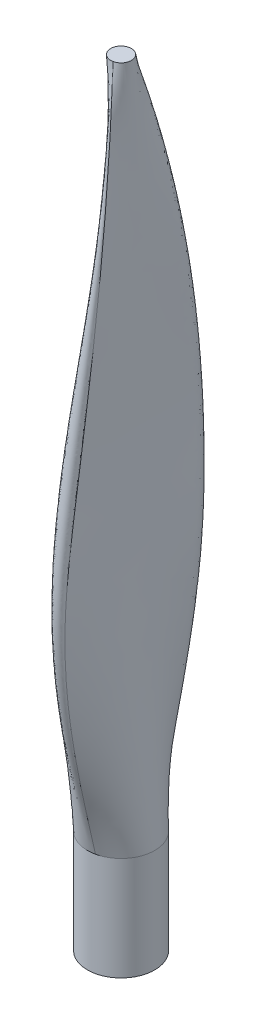
ISO-10303-21;
HEADER;
FILE_DESCRIPTION(('STEP AP214'),'2;1');
FILE_NAME('part.step','',(''),(''),'','','');
FILE_SCHEMA(('AUTOMOTIVE_DESIGN { 1 0 10303 214 1 1 1 1 }'));
ENDSEC;
DATA;
#1=APPLICATION_CONTEXT('core data for automotive mechanical design processes');
#2=APPLICATION_PROTOCOL_DEFINITION('international standard','automotive_design',2000,#1);
#3=PRODUCT_CONTEXT('',#1,'mechanical');
#4=PRODUCT('Part','Part','',(#3));
#5=PRODUCT_RELATED_PRODUCT_CATEGORY('part','',(#4));
#6=PRODUCT_DEFINITION_FORMATION('','',#4);
#7=PRODUCT_DEFINITION_CONTEXT('part definition',#1,'design');
#8=PRODUCT_DEFINITION('design','',#6,#7);
#9=PRODUCT_DEFINITION_SHAPE('','',#8);
#10=(LENGTH_UNIT() NAMED_UNIT(*) SI_UNIT(.MILLI.,.METRE.));
#11=(NAMED_UNIT(*) PLANE_ANGLE_UNIT() SI_UNIT($,.RADIAN.));
#12=(NAMED_UNIT(*) SI_UNIT($,.STERADIAN.) SOLID_ANGLE_UNIT());
#13=UNCERTAINTY_MEASURE_WITH_UNIT(LENGTH_MEASURE(1.E-05),#10,'distance_accuracy_value','');
#14=(GEOMETRIC_REPRESENTATION_CONTEXT(3) GLOBAL_UNCERTAINTY_ASSIGNED_CONTEXT((#13)) GLOBAL_UNIT_ASSIGNED_CONTEXT((#10,
#11,#12)) REPRESENTATION_CONTEXT('',''));
#15=CARTESIAN_POINT('',(0.,0.,0.));
#16=DIRECTION('',(0.,0.,1.));
#17=DIRECTION('',(1.,0.,0.));
#18=AXIS2_PLACEMENT_3D('',#15,#16,#17);
#19=CARTESIAN_POINT('',(0.,25.4,0.));
#20=DIRECTION('',(0.,-1.,0.));
#21=DIRECTION('',(0.,0.,-1.));
#22=AXIS2_PLACEMENT_3D('',#19,#20,#21);
#23=CYLINDRICAL_SURFACE('',#22,8.255);
#24=CARTESIAN_POINT('',(1.78555813566445,25.4,8.05957859594176));
#25=CARTESIAN_POINT('',(2.59050639397903,25.4,7.88124645433993));
#26=CARTESIAN_POINT('',(4.20936344843216,25.4,7.26781680666261));
#27=CARTESIAN_POINT('',(6.36455046544477,25.4,5.50919366141008));
#28=CARTESIAN_POINT('',(7.88067932947462,25.4,2.99871880317784));
#29=CARTESIAN_POINT('',(8.4373747026476,25.4,0.0304091416200693));
#30=CARTESIAN_POINT('',(7.90208968311207,25.4,-2.9418361264004));
#31=CARTESIAN_POINT('',(6.40409597568528,25.4,-5.46317418359752));
#32=CARTESIAN_POINT('',(4.26164129017385,25.4,-7.23728645903209));
#33=CARTESIAN_POINT('',(2.64724795765117,25.4,-7.86236906422));
#34=CARTESIAN_POINT('',(1.527091367385,25.4,-8.1190182646792));
#35=CARTESIAN_POINT('',(1.02438835663904,25.4,-8.19993235199964));
#36=CARTESIAN_POINT('',(0.371715654088652,25.4,-8.25490961165125));
#37=CARTESIAN_POINT('',(-0.221310676800932,25.4,-8.25837391978235));
#38=CARTESIAN_POINT('',(-0.792982214725457,25.4,-8.2237700451583));
#39=CARTESIAN_POINT('',(-1.36078447053422,25.4,-8.14841986730937));
#40=CARTESIAN_POINT('',(-1.94205482454606,25.4,-8.0318465731963));
#41=CARTESIAN_POINT('',(-2.57228784232322,25.4,-7.85311618795597));
#42=CARTESIAN_POINT('',(-3.0502387936296,25.4,-7.67766298611585));
#43=CARTESIAN_POINT('',(-3.34706615412364,25.4,-7.5460037874308));
#44=B_SPLINE_CURVE_WITH_KNOTS('',3,(#24,#25,#26,#27,#28,#29,#30,#31,#32,#33,#34,#35,#36,#37,#38,
#39,#40,#41,#42,#43),.UNSPECIFIED.,.F.,.F.,(4,1,1,1,1,1,1,1,2,1,1,1,1,1,1,1,4),(0.,
0.0896796390726791,0.179359278145358,0.269038917218037,0.358718556290716,0.448398195363395,
0.538077834436074,0.627757473508753,0.717437112581432,0.752757473508753,0.788077834436074,
0.823398195363395,0.858718556290716,0.894038917218037,0.929359278145358,0.964679639072679,1.),.UNSPECIFIED.);
#45=CARTESIAN_POINT('',(1.78556059045784,25.4,8.05958974388151));
#46=VERTEX_POINT('',#45);
#47=CARTESIAN_POINT('',(-3.34707167424489,25.4,-7.54601628467142));
#48=VERTEX_POINT('',#47);
#49=EDGE_CURVE('E12',#46,#48,#44,.T.);
#50=ORIENTED_EDGE('',*,*,#49,.F.);
#51=CARTESIAN_POINT('',(0.,25.4,0.));
#52=DIRECTION('',(0.,-1.,0.));
#53=DIRECTION('',(0.,0.,1.));
#54=AXIS2_PLACEMENT_3D('',#51,#52,#53);
#55=CIRCLE('',#54,8.255);
#56=EDGE_CURVE('E203',#48,#46,#55,.F.);
#57=ORIENTED_EDGE('',*,*,#56,.F.);
#58=EDGE_LOOP('',(#50,#57));
#59=FACE_BOUND('',#58,.T.);
#60=CARTESIAN_POINT('',(0.,0.,0.));
#61=DIRECTION('',(0.,1.,0.));
#62=DIRECTION('',(0.,0.,1.));
#63=AXIS2_PLACEMENT_3D('',#60,#61,#62);
#64=CIRCLE('',#63,8.255);
#65=CARTESIAN_POINT('',(0.,0.,8.255));
#66=VERTEX_POINT('',#65);
#67=EDGE_CURVE('E209',#66,#66,#64,.T.);
#68=ORIENTED_EDGE('',*,*,#67,.T.);
#69=EDGE_LOOP('',(#68));
#70=FACE_BOUND('',#69,.T.);
#71=ADVANCED_FACE('F199',(#59,#70),#23,.T.);
#72=CARTESIAN_POINT('',(0.,0.,0.));
#73=DIRECTION('',(0.,1.,0.));
#74=DIRECTION('',(0.,0.,1.));
#75=AXIS2_PLACEMENT_3D('',#72,#73,#74);
#76=PLANE('',#75);
#77=ORIENTED_EDGE('',*,*,#67,.F.);
#78=EDGE_LOOP('',(#77));
#79=FACE_BOUND('',#78,.T.);
#80=ADVANCED_FACE('F262',(#79),#76,.F.);
#81=CARTESIAN_POINT('',(0.,190.5,0.));
#82=DIRECTION('',(0.,1.,0.));
#83=DIRECTION('',(0.,0.,1.));
#84=AXIS2_PLACEMENT_3D('',#81,#82,#83);
#85=PLANE('',#84);
#86=CARTESIAN_POINT('',(0.,190.5,0.));
#87=DIRECTION('',(0.,1.,0.));
#88=DIRECTION('',(0.,0.,1.));
#89=AXIS2_PLACEMENT_3D('',#86,#87,#88);
#90=CIRCLE('',#89,2.54);
#91=CARTESIAN_POINT('',(0.549402503281368,190.5,2.47987033721285));
#92=VERTEX_POINT('',#91);
#93=CARTESIAN_POINT('',(-1.02986650896112,190.5,-2.32184731920948));
#94=VERTEX_POINT('',#93);
#95=EDGE_CURVE('E237',#92,#94,#90,.T.);
#96=ORIENTED_EDGE('',*,*,#95,.T.);
#97=EDGE_CURVE('E230',#94,#92,#90,.T.);
#98=ORIENTED_EDGE('',*,*,#97,.T.);
#99=EDGE_LOOP('',(#96,#98));
#100=FACE_BOUND('',#99,.T.);
#101=ADVANCED_FACE('F245',(#100),#85,.T.);
#102=CARTESIAN_POINT('',(-1.02986650896112,190.5,-2.32184731920948));
#103=CARTESIAN_POINT('',(-1.59442581146721,177.895467947038,-5.59500735136561));
#104=CARTESIAN_POINT('',(-2.58344291094922,150.366533641712,-10.8440093626226));
#105=CARTESIAN_POINT('',(-7.14512934381434,114.375713900902,-15.3843061008378));
#106=CARTESIAN_POINT('',(-4.02771879132097,71.815530601134,-13.3825588323875));
#107=CARTESIAN_POINT('',(-3.80926628474453,44.4162844445931,-10.0243451322647));
#108=CARTESIAN_POINT('',(-3.34706615412364,25.4,-7.5460037874308));
#109=CARTESIAN_POINT('',(-0.938535013424492,190.5,-2.3623578418818));
#110=CARTESIAN_POINT('',(-1.54785856125034,177.904709549944,-5.75964862664666));
#111=CARTESIAN_POINT('',(-2.64204541374306,150.361560271261,-11.1966012019639));
#112=CARTESIAN_POINT('',(-7.08659282560504,114.376062506721,-15.8986302858121));
#113=CARTESIAN_POINT('',(-3.92030031120604,71.8163451441896,-13.9639833078109));
#114=CARTESIAN_POINT('',(-3.5451478622632,44.4099791608603,-10.3465068344214));
#115=CARTESIAN_POINT('',(-3.0502387936296,25.4,-7.67766298611585));
#116=CARTESIAN_POINT('',(-0.784499818303792,190.5,-2.42074747724139));
#117=CARTESIAN_POINT('',(-1.48335185676915,177.923192755757,-6.06629976722371));
#118=CARTESIAN_POINT('',(-2.59710045669846,150.35161353036,-11.9759561799458));
#119=CARTESIAN_POINT('',(-6.83296824210966,114.376759718359,-16.9807455575999));
#120=CARTESIAN_POINT('',(-3.44987275449992,71.8179742303004,-15.1311615805163));
#121=CARTESIAN_POINT('',(-3.13261478698225,44.3973685933947,-10.9029650432048));
#122=CARTESIAN_POINT('',(-2.57228784232322,25.4,-7.85311618795597));
#123=CARTESIAN_POINT('',(-0.599522252737166,190.5,-2.46904317247534));
#124=CARTESIAN_POINT('',(-1.18278071049137,177.95572930943,-6.54727812671075));
#125=CARTESIAN_POINT('',(-2.07102761692273,150.334032571394,-13.1468576581424));
#126=CARTESIAN_POINT('',(-5.79062496272679,114.378225242534,-18.614110224769));
#127=CARTESIAN_POINT('',(-2.11737512071666,71.8201294843443,-16.5660961557315));
#128=CARTESIAN_POINT('',(-2.19616793357159,44.3788771612067,-11.6008849669146));
#129=CARTESIAN_POINT('',(-1.94205482454606,25.4,-8.0318465731963));
#130=CARTESIAN_POINT('',(-0.420811753541721,190.5,-2.50665558205353));
#131=CARTESIAN_POINT('',(-0.690575327052379,177.983492584502,-6.93561731898137));
#132=CARTESIAN_POINT('',(-1.01286411504266,150.318977167162,-14.0844703265104));
#133=CARTESIAN_POINT('',(-3.99141949170393,114.379654775179,-19.8895789493286));
#134=CARTESIAN_POINT('',(-0.295952739403749,71.8214331252377,-17.4151943536079));
#135=CARTESIAN_POINT('',(-1.11348465247916,44.3658845825056,-12.0249393266166));
#136=CARTESIAN_POINT('',(-1.36078447053422,25.4,-8.14841986730937));
#137=CARTESIAN_POINT('',(-0.244468324611801,190.5,-2.53139656919809));
#138=CARTESIAN_POINT('',(-0.0371378941574225,177.998328277443,-7.11565613754245));
#139=CARTESIAN_POINT('',(0.4308018825792,150.310905377196,-14.4797887253962));
#140=CARTESIAN_POINT('',(-1.63936277567153,114.380507816552,-20.3257232408771));
#141=CARTESIAN_POINT('',(1.71795951046237,71.8218630880541,-17.5214020583062));
#142=CARTESIAN_POINT('',(0.0592642512986882,44.3603293482577,-12.1230736562805));
#143=CARTESIAN_POINT('',(-0.792982214725457,25.4,-8.2237700451583));
#144=CARTESIAN_POINT('',(-0.0665919698417477,190.5,-2.54107799713113));
#145=CARTESIAN_POINT('',(0.631082593073801,177.994696417385,-7.01484234337365));
#146=CARTESIAN_POINT('',(1.89808113211071,150.312843192217,-14.1717343254937));
#147=CARTESIAN_POINT('',(0.662357281042573,114.380426430725,-19.6914516573778));
#148=CARTESIAN_POINT('',(3.62949030266401,71.8213766386147,-16.8768200981627));
#149=CARTESIAN_POINT('',(1.19307546238609,44.3636728158945,-11.8815955508249));
#150=CARTESIAN_POINT('',(-0.221310676800932,25.4,-8.25837391978235));
#151=CARTESIAN_POINT('',(0.11622157215848,190.5,-2.53842489430405));
#152=CARTESIAN_POINT('',(1.16264918813479,177.97530903893,-6.69015585215801));
#153=CARTESIAN_POINT('',(3.01381472577918,150.323277563446,-13.2943541731679));
#154=CARTESIAN_POINT('',(2.33945540426507,114.379691611008,-18.2775126271436));
#155=CARTESIAN_POINT('',(5.16445782425612,71.8196783329873,-15.5734929720246));
#156=CARTESIAN_POINT('',(2.17200477543316,44.3768457784346,-11.3498354138236));
#157=CARTESIAN_POINT('',(0.371715654088652,25.4,-8.25490961165125));
#158=CARTESIAN_POINT('',(0.307376562778926,190.5,-2.52616228916827));
#159=CARTESIAN_POINT('',(1.51098639598856,177.947922816435,-6.25771923356954));
#160=CARTESIAN_POINT('',(3.61059735327996,150.33797897239,-12.145561754399));
#161=CARTESIAN_POINT('',(3.23834206494892,114.378780298442,-16.5800906610453));
#162=CARTESIAN_POINT('',(6.0871244674054,71.8169004346731,-13.8282056102837));
#163=CARTESIAN_POINT('',(2.95630930702945,44.3974252599637,-10.6121250021854));
#164=CARTESIAN_POINT('',(1.02438835663904,25.4,-8.19993235199964));
#165=CARTESIAN_POINT('',(0.469874266887692,190.5,-2.49815946605514));
#166=CARTESIAN_POINT('',(1.61744210514236,177.928905872056,-5.96239821164446));
#167=CARTESIAN_POINT('',(3.69420147676663,150.348137278579,-11.3669901716579));
#168=CARTESIAN_POINT('',(3.40652899664411,114.378315365825,-15.4914678071628));
#169=CARTESIAN_POINT('',(6.24678355719975,71.8144693226664,-12.5665879054203));
#170=CARTESIAN_POINT('',(3.28059633113446,44.4143284999278,-10.0697834666226));
#171=CARTESIAN_POINT('',(1.527091367385,25.4,-8.1190182646792));
#172=CARTESIAN_POINT('',(0.814537833123436,190.5,-2.41919048129846));
#173=CARTESIAN_POINT('',(1.83190087598887,177.897809298975,-5.43564959059852));
#174=CARTESIAN_POINT('',(3.56183175994945,150.364777158509,-10.084231125563));
#175=CARTESIAN_POINT('',(3.47119057059723,114.377458424382,-13.686761712446));
#176=CARTESIAN_POINT('',(6.09647521570633,71.8107831425518,-10.4197854987484));
#177=CARTESIAN_POINT('',(4.01475587434873,44.4404639880445,-9.04366803683972));
#178=CARTESIAN_POINT('',(2.64724795765117,25.4,-7.86236906422));
#179=CARTESIAN_POINT('',(1.31127903904887,190.5,-2.22685937966024));
#180=CARTESIAN_POINT('',(2.02873887878904,177.8624952416,-4.69278212897669));
#181=CARTESIAN_POINT('',(3.43782203521925,150.383788090614,-8.32069891718443));
#182=CARTESIAN_POINT('',(3.5389324004953,114.376104096372,-11.2204041491108));
#183=CARTESIAN_POINT('',(5.93341244160383,71.8077371094999,-7.39286405818861));
#184=CARTESIAN_POINT('',(4.81922332138919,44.4642117244114,-7.48586594886439));
#185=CARTESIAN_POINT('',(4.26164129017385,25.4,-7.23728645903209));
#186=CARTESIAN_POINT('',(1.97047863284145,190.5,-1.68097625028358));
#187=CARTESIAN_POINT('',(2.37000723355507,177.830906096335,-3.48229243002693));
#188=CARTESIAN_POINT('',(3.22559331987151,150.401243768465,-5.90416351137107));
#189=CARTESIAN_POINT('',(3.64712813808736,114.373391446226,-7.73558842009217));
#190=CARTESIAN_POINT('',(5.67837480657058,71.8095024923871,-3.03391643614963));
#191=CARTESIAN_POINT('',(6.06997636373259,44.4620904227101,-4.67861002785291));
#192=CARTESIAN_POINT('',(6.40409597568528,25.4,-5.46317418359752));
#193=CARTESIAN_POINT('',(2.43145936596673,190.5,-0.905134528351107));
#194=CARTESIAN_POINT('',(2.59005942330586,177.811102330371,-2.19156195637006));
#195=CARTESIAN_POINT('',(3.08821694429529,150.412406764154,-3.62496689241535));
#196=CARTESIAN_POINT('',(3.71866095663579,114.370957824067,-4.34220882079984));
#197=CARTESIAN_POINT('',(5.50863818327839,71.8128017427954,1.18645039178404));
#198=CARTESIAN_POINT('',(6.90397911164548,44.4493519609165,-1.48523476520052));
#199=CARTESIAN_POINT('',(7.90208968311207,25.4,-2.9418361264004));
#200=CARTESIAN_POINT('',(2.59608389323987,190.5,0.00935654579170629));
#201=CARTESIAN_POINT('',(2.67187192748021,177.796470984679,-0.844483441448302));
#202=CARTESIAN_POINT('',(3.03722980258372,150.420645482255,-1.42437897133735));
#203=CARTESIAN_POINT('',(3.74496374641487,114.369188797624,-0.989910804872649));
#204=CARTESIAN_POINT('',(5.44640624269978,71.8151526215789,5.32691999081058));
#205=CARTESIAN_POINT('',(7.20950304963113,44.4403915152955,1.95276306938001));
#206=CARTESIAN_POINT('',(8.4373747026476,25.4,0.0304091416200693));
#207=CARTESIAN_POINT('',(2.42487189388516,190.5,0.922637231530635));
#208=CARTESIAN_POINT('',(2.58836885462649,177.783493275623,0.501370999819163));
#209=CARTESIAN_POINT('',(3.08932557159308,150.427847519317,0.776976808818751));
#210=CARTESIAN_POINT('',(3.7179338578142,114.367971774111,2.36197701568779));
#211=CARTESIAN_POINT('',(5.51047323951472,71.8161847459796,9.46837051549763));
#212=CARTESIAN_POINT('',(6.89480857172834,44.4379233168906,5.38593046257759));
#213=CARTESIAN_POINT('',(7.88067932947462,25.4,2.99871880317784));
#214=CARTESIAN_POINT('',(1.95831078689865,190.5,1.69513599997715));
#215=CARTESIAN_POINT('',(2.36141152706452,177.774484803989,1.79745602465188));
#216=CARTESIAN_POINT('',(3.23091599355896,150.433041280116,3.05319744608803));
#217=CARTESIAN_POINT('',(3.64447915660815,114.366478253262,5.7558735980435));
#218=CARTESIAN_POINT('',(5.68457064956027,71.8188415744961,13.6882670935765));
#219=CARTESIAN_POINT('',(6.03965898136185,44.4261133430949,8.58055512442343));
#220=CARTESIAN_POINT('',(6.36455046544477,25.4,5.50919366141008));
#221=CARTESIAN_POINT('',(1.29519353468625,190.5,2.23625336729465));
#222=CARTESIAN_POINT('',(2.03891155376313,177.772796387835,2.99477930396659));
#223=CARTESIAN_POINT('',(3.43210179767385,150.43470406126,5.47775438988559));
#224=CARTESIAN_POINT('',(3.54013611831185,114.363898788707,9.23707021285271));
#225=CARTESIAN_POINT('',(5.93185639921679,71.8262176174829,18.0553937352183));
#226=CARTESIAN_POINT('',(4.82504503696143,44.3881100579026,11.3481965184434));
#227=CARTESIAN_POINT('',(4.20936344843216,25.4,7.26781680666261));
#228=CARTESIAN_POINT('',(0.797078890455086,190.5,2.42499890902767));
#229=CARTESIAN_POINT('',(1.7951313177968,177.787874428023,3.78099464289434));
#230=CARTESIAN_POINT('',(3.58419501489345,150.42789014826,7.21625010603989));
#231=CARTESIAN_POINT('',(3.4612113511465,114.360129802344,11.7107633220837));
#232=CARTESIAN_POINT('',(6.11893432409387,71.8405210888279,21.0690854959724));
#233=CARTESIAN_POINT('',(3.90611432405927,44.3103104747342,12.9651440447228));
#234=CARTESIAN_POINT('',(2.59050639397903,25.4,7.88124645433993));
#235=CARTESIAN_POINT('',(0.549402503281368,190.5,2.47987033721285));
#236=CARTESIAN_POINT('',(1.6746221347555,177.795413448117,4.13460096967688));
#237=CARTESIAN_POINT('',(3.65939403275394,150.424483191759,8.15102709752462));
#238=CARTESIAN_POINT('',(3.42214945721896,114.358245309162,12.9999410173968));
#239=CARTESIAN_POINT('',(6.2115529150998,71.8476728245004,22.6211036391982));
#240=CARTESIAN_POINT('',(3.45112923652017,44.2714106831501,13.6452351256257));
#241=CARTESIAN_POINT('',(1.78555813566445,25.4,8.05957859594176));
#242=B_SPLINE_SURFACE_WITH_KNOTS('',3,3,((#102,#103,#104,#105,#106,#107,#108),(#109,#110,#111,
#112,#113,#114,#115),(#116,#117,#118,#119,#120,#121,#122),(#123,#124,#125,#126,#127,#128,#129),
(#130,#131,#132,#133,#134,#135,#136),(#137,#138,#139,#140,#141,#142,#143),(#144,#145,#146,#147,
#148,#149,#150),(#151,#152,#153,#154,#155,#156,#157),(#158,#159,#160,#161,#162,#163,#164),(#165,
#166,#167,#168,#169,#170,#171),(#172,#173,#174,#175,#176,#177,#178),(#179,#180,#181,#182,#183,
#184,#185),(#186,#187,#188,#189,#190,#191,#192),(#193,#194,#195,#196,#197,#198,#199),(#200,#201,
#202,#203,#204,#205,#206),(#207,#208,#209,#210,#211,#212,#213),(#214,#215,#216,#217,#218,#219,
#220),(#221,#222,#223,#224,#225,#226,#227),(#228,#229,#230,#231,#232,#233,#234),(#235,#236,#237,
#238,#239,#240,#241)),.UNSPECIFIED.,.F.,.F.,.F.,(4,1,1,1,1,1,1,1,2,1,1,1,1,1,1,1,4),(4,1,1,1,4),
(0.,0.035320360927321,0.0706407218546419,0.105961082781963,0.141281443709284,0.176601804636605,
0.211922165563926,0.247242526491247,0.282562887418568,0.372242526491247,0.461922165563926,
0.551601804636605,0.641281443709284,0.730961082781963,0.820640721854642,0.910320360927321,1.),
(0.,0.231690006690866,0.500467318378717,0.653573383435004,1.),.UNSPECIFIED.);
#243=CARTESIAN_POINT('',(0.549402503281368,190.5,2.47987033721285));
#244=CARTESIAN_POINT('',(1.6746221347555,177.795413448117,4.13460096967688));
#245=CARTESIAN_POINT('',(3.65939403275394,150.424483191759,8.15102709752462));
#246=CARTESIAN_POINT('',(3.42214945721896,114.358245309162,12.9999410173968));
#247=CARTESIAN_POINT('',(6.2115529150998,71.8476728245004,22.6211036391982));
#248=CARTESIAN_POINT('',(3.45112923652017,44.2714106831501,13.6452351256257));
#249=CARTESIAN_POINT('',(1.78555813566445,25.4,8.05957859594176));
#250=B_SPLINE_CURVE_WITH_KNOTS('',3,(#243,#244,#245,#246,#247,#248,#249),.UNSPECIFIED.,.F.,.F.,
(4,1,1,1,4),(0.,0.231690006690866,0.500467318378717,0.653573383435004,1.),.UNSPECIFIED.);
#251=EDGE_CURVE('E225',#92,#46,#250,.T.);
#252=CARTESIAN_POINT('',(-1.02986650896112,190.5,-2.32184731920948));
#253=CARTESIAN_POINT('',(-1.59442581146721,177.895467947038,-5.59500735136561));
#254=CARTESIAN_POINT('',(-2.58344291094922,150.366533641712,-10.8440093626226));
#255=CARTESIAN_POINT('',(-7.14512934381434,114.375713900902,-15.3843061008378));
#256=CARTESIAN_POINT('',(-4.02771879132097,71.815530601134,-13.3825588323875));
#257=CARTESIAN_POINT('',(-3.80926628474453,44.4162844445931,-10.0243451322647));
#258=CARTESIAN_POINT('',(-3.34706615412364,25.4,-7.5460037874308));
#259=B_SPLINE_CURVE_WITH_KNOTS('',3,(#252,#253,#254,#255,#256,#257,#258),.UNSPECIFIED.,.F.,.F.,
(4,1,1,1,4),(0.,0.231690006690866,0.500467318378717,0.653573383435004,1.),.UNSPECIFIED.);
#260=EDGE_CURVE('E235',#48,#94,#259,.F.);
#261=ORIENTED_EDGE('',*,*,#95,.F.);
#262=ORIENTED_EDGE('',*,*,#251,.T.);
#263=ORIENTED_EDGE('',*,*,#49,.T.);
#264=ORIENTED_EDGE('',*,*,#260,.T.);
#265=EDGE_LOOP('',(#261,#262,#263,#264));
#266=FACE_BOUND('',#265,.T.);
#267=ADVANCED_FACE('F239',(#266),#242,.T.);
#268=CARTESIAN_POINT('',(0.549402503281368,190.5,2.47987033721285));
#269=CARTESIAN_POINT('',(1.6746221347555,177.795413448117,4.13460096967688));
#270=CARTESIAN_POINT('',(3.65939403275395,150.424483191759,8.15102709752461));
#271=CARTESIAN_POINT('',(3.42214945721896,114.358245309162,12.9999410173968));
#272=CARTESIAN_POINT('',(6.21155291509981,71.8476728245004,22.6211036391981));
#273=CARTESIAN_POINT('',(3.45112923652018,44.2714106831501,13.6452351256257));
#274=CARTESIAN_POINT('',(1.78555813566445,25.4,8.05957859594176));
#275=CARTESIAN_POINT('',(0.524300753611966,190.5,2.48543150059231));
#276=CARTESIAN_POINT('',(1.63570586987559,177.795568126782,4.16568789977186));
#277=CARTESIAN_POINT('',(3.61859872852168,150.424488348225,8.23350544621707));
#278=CARTESIAN_POINT('',(3.5309358116622,114.357956263942,13.0925866832587));
#279=CARTESIAN_POINT('',(6.21276903433453,71.8485684639053,22.7807137757182));
#280=CARTESIAN_POINT('',(3.39626313179835,44.2667156723827,13.7188353107414));
#281=CARTESIAN_POINT('',(1.70397744923889,25.4,8.077652376925));
#282=CARTESIAN_POINT('',(0.484004991196428,190.5,2.49376708257606));
#283=CARTESIAN_POINT('',(1.56778107703903,177.795877484114,4.22507501518665));
#284=CARTESIAN_POINT('',(3.48677690858826,150.424498661158,8.38116511072528));
#285=CARTESIAN_POINT('',(3.77013799133657,114.357378173503,13.3408662642578));
#286=CARTESIAN_POINT('',(6.12824381721835,71.8503597427152,23.0961551967492));
#287=CARTESIAN_POINT('',(3.3187310673553,44.257325650848,13.8569787604536));
#288=CARTESIAN_POINT('',(1.57301622138839,25.4,8.10474301837221));
#289=CARTESIAN_POINT('',(0.446596036761921,190.5,2.50043100505149));
#290=CARTESIAN_POINT('',(1.45636485669838,177.789897263487,4.2582026221338));
#291=CARTESIAN_POINT('',(3.26357604089686,150.428019600343,8.46709198993889));
#292=CARTESIAN_POINT('',(3.99812453058039,114.356142884135,13.9325365794251));
#293=CARTESIAN_POINT('',(5.87867430396801,71.8528527582307,23.3488851670994));
#294=CARTESIAN_POINT('',(3.16295586811015,44.2456908141551,13.9903978828782));
#295=CARTESIAN_POINT('',(1.45143711947624,25.4,8.12640076641733));
#296=CARTESIAN_POINT('',(0.417360166131314,190.5,2.50543559418943));
#297=CARTESIAN_POINT('',(1.37189469917514,177.781942287507,4.25797823315195));
#298=CARTESIAN_POINT('',(3.08702711232093,150.4325590509,8.45811904039381));
#299=CARTESIAN_POINT('',(3.98339112159056,114.354980561628,14.5675063613171));
#300=CARTESIAN_POINT('',(5.66122378931579,71.8547306662897,23.4301761198824));
#301=CARTESIAN_POINT('',(3.02936742629124,44.2376983062546,14.0611333914661));
#302=CARTESIAN_POINT('',(1.35642053992677,25.4,8.14266568111566));
#303=CARTESIAN_POINT('',(0.395683786441085,190.5,2.50900444858904));
#304=CARTESIAN_POINT('',(1.31339792322756,177.775506435573,4.25000787086153));
#305=CARTESIAN_POINT('',(2.96876403950973,150.436203674242,8.43078889211109));
#306=CARTESIAN_POINT('',(3.84424063629428,114.354133439334,15.040628788252));
#307=CARTESIAN_POINT('',(5.51133368939061,71.8559710808465,23.4616126635165));
#308=CARTESIAN_POINT('',(2.92701261943825,44.2326832198267,14.1034404438093));
#309=CARTESIAN_POINT('',(1.28597230593353,25.4,8.15426445791437));
#310=CARTESIAN_POINT('',(0.374162806857811,190.5,2.51236740250212));
#311=CARTESIAN_POINT('',(1.26006866724995,177.769364629097,4.23762575757386));
#312=CARTESIAN_POINT('',(2.86382140685056,150.439662437792,8.39259470499647));
#313=CARTESIAN_POINT('',(3.59794460151715,114.353389542673,15.458962727277));
#314=CARTESIAN_POINT('',(5.37043191405043,71.8569618334984,23.4782034927908));
#315=CARTESIAN_POINT('',(2.82288793911425,44.2289014752939,14.1374562682787));
#316=CARTESIAN_POINT('',(1.21602912228788,25.4,8.16519405813188));
#317=CARTESIAN_POINT('',(0.352702104205717,190.5,2.51550314289601));
#318=CARTESIAN_POINT('',(1.21231385143687,177.763791407622,4.22139585315686));
#319=CARTESIAN_POINT('',(2.77382056583598,150.442782357608,8.34565520195481));
#320=CARTESIAN_POINT('',(3.25711919085279,114.352776709023,15.8012033949603));
#321=CARTESIAN_POINT('',(5.24134758751333,71.857674833819,23.4833837929097));
#322=CARTESIAN_POINT('',(2.71817242980025,44.2264378402034,14.1633525968565));
#323=CARTESIAN_POINT('',(1.14628183866858,25.4,8.17538521441205));
#324=CARTESIAN_POINT('',(0.331206555309032,190.5,2.51839035673806));
#325=CARTESIAN_POINT('',(1.16983361933793,177.759018308047,4.20177087482102));
#326=CARTESIAN_POINT('',(2.69774165744664,150.445433887583,8.29159503946566));
#327=CARTESIAN_POINT('',(2.84443344356637,114.352320166389,16.047889653263));
#328=CARTESIAN_POINT('',(5.12177028722445,71.8580811541176,23.4796608691849));
#329=CARTESIAN_POINT('',(2.61304585663038,44.2253910561398,14.1810251289438));
#330=CARTESIAN_POINT('',(1.07642130475435,25.4,8.18476865939871));
#331=CARTESIAN_POINT('',(0.309590566405148,190.5,2.52107569562774));
#332=CARTESIAN_POINT('',(1.13225891719557,177.755378906745,4.18098419940448));
#333=CARTESIAN_POINT('',(2.63445312558293,150.447433575864,8.23642575410639));
#334=CARTESIAN_POINT('',(2.38579713165386,114.352045633232,16.1831031519184));
#335=CARTESIAN_POINT('',(5.01010132439153,71.8581709061829,23.472752316566));
#336=CARTESIAN_POINT('',(2.50809312146806,44.2257379729321,14.1917206435399));
#337=CARTESIAN_POINT('',(1.00616934081673,25.4,8.19349601079014));
#338=CARTESIAN_POINT('',(0.287768543731454,190.5,2.52360581116449));
#339=CARTESIAN_POINT('',(1.09932564020036,177.753057607521,4.16048597706857));
#340=CARTESIAN_POINT('',(2.58338249845473,150.448680057144,8.18357443077326));
#341=CARTESIAN_POINT('',(1.90507055183778,114.351967165448,16.2009234255499));
#342=CARTESIAN_POINT('',(4.90581365531271,71.8579391067322,23.4632941721132));
#343=CARTESIAN_POINT('',(2.4039522243726,44.2274632796895,14.1955033751547));
#344=CARTESIAN_POINT('',(0.935247767127226,25.4,8.2017188862846));
#345=CARTESIAN_POINT('',(0.258283676789974,190.5,2.52683453620891));
#346=CARTESIAN_POINT('',(1.0580371730765,177.751810556439,4.13471384871674));
#347=CARTESIAN_POINT('',(2.51976742769222,150.449291609956,8.11980994440792));
#348=CARTESIAN_POINT('',(1.30896522066787,114.352118769031,16.0647894731266));
#349=CARTESIAN_POINT('',(4.7562304058287,71.8572350351548,23.4521721262433));
#350=CARTESIAN_POINT('',(2.26340059905173,44.2314057809688,14.1924346439137));
#351=CARTESIAN_POINT('',(0.839421949567414,25.4,8.21221224267896));
#352=CARTESIAN_POINT('',(0.220484539875558,190.5,2.53071564212949));
#353=CARTESIAN_POINT('',(0.999027394052454,177.751743569076,4.09686258363322));
#354=CARTESIAN_POINT('',(2.42128338902274,150.449185547132,8.02119164129088));
#355=CARTESIAN_POINT('',(0.814595592731022,114.352590308988,15.7350350512559));
#356=CARTESIAN_POINT('',(4.49876769690486,71.8558111643144,23.3753188166947));
#357=CARTESIAN_POINT('',(2.06760424724197,44.2388298073528,14.1608440653313));
#358=CARTESIAN_POINT('',(0.716574754595565,25.4,8.22482583692083));
#359=CARTESIAN_POINT('',(0.179450178105864,190.5,2.53378346706114));
#360=CARTESIAN_POINT('',(0.95507325915788,177.750926048166,4.04979667906373));
#361=CARTESIAN_POINT('',(2.34403970157235,150.449495374828,7.89896348102305));
#362=CARTESIAN_POINT('',(0.625715326527373,114.352993538301,15.4890255215706));
#363=CARTESIAN_POINT('',(4.28143838557417,71.8544407836819,23.1953717238391));
#364=CARTESIAN_POINT('',(1.91228220441205,44.2461433537611,14.0849630940803));
#365=CARTESIAN_POINT('',(0.583213078844059,25.4,8.23479626794871));
#366=CARTESIAN_POINT('',(-0.131354507251694,190.5,2.55263604808458));
#367=CARTESIAN_POINT('',(0.633392964699017,177.746085180174,3.76461203103925));
#368=CARTESIAN_POINT('',(2.05849154073112,150.451326952983,7.04673354196316));
#369=CARTESIAN_POINT('',(-0.27483344012441,114.355391346011,14.1784576439751));
#370=CARTESIAN_POINT('',(3.26928829430973,71.8462959253214,21.7919205274012));
#371=CARTESIAN_POINT('',(0.787953555576868,44.2896073816797,13.6217125992646));
#372=CARTESIAN_POINT('',(-0.426902148568004,25.4,8.29606715627489));
#373=CARTESIAN_POINT('',(-0.714160914250666,190.5,2.49043778802209));
#374=CARTESIAN_POINT('',(0.16936293684631,177.739437026284,3.13527186766587));
#375=CARTESIAN_POINT('',(1.48800059067513,150.453779046868,5.51276171932839));
#376=CARTESIAN_POINT('',(-1.73742311601541,114.358895457097,11.7611489835347));
#377=CARTESIAN_POINT('',(1.47895338070778,71.8344788340975,19.1340806117138));
#378=CARTESIAN_POINT('',(-0.933154407111169,44.3525838927488,12.3622977521283));
#379=CARTESIAN_POINT('',(-2.32103492211737,25.4000000000001,8.09392838893377));
#380=CARTESIAN_POINT('',(-1.52008916406933,190.500000000001,2.09994184715276));
#381=CARTESIAN_POINT('',(-0.570512976450129,177.74434081871,2.06702864985689));
#382=CARTESIAN_POINT('',(0.768590566345302,150.450123347576,3.19775346029779));
#383=CARTESIAN_POINT('',(-3.54082037445782,114.362472084094,8.12677612362384));
#384=CARTESIAN_POINT('',(-0.726768789319749,71.8247663902411,14.8463387992766));
#385=CARTESIAN_POINT('',(-3.45346177656717,44.4020254239953,9.91875490083716));
#386=CARTESIAN_POINT('',(-4.94016294824707,25.3999999999999,6.82484536501964));
#387=CARTESIAN_POINT('',(-2.15096684945886,190.5,1.44871317452317));
#388=CARTESIAN_POINT('',(-1.16746442563716,177.755994417725,0.845412959116849));
#389=CARTESIAN_POINT('',(0.0967890122321108,150.443240799091,0.902792076016913));
#390=CARTESIAN_POINT('',(-4.98671454509199,114.364950427427,4.44714430641153));
#391=CARTESIAN_POINT('',(-2.48735429138016,71.819695469935,10.358042202075));
#392=CARTESIAN_POINT('',(-5.37921613142948,44.4258054387598,6.8468424385863));
#393=CARTESIAN_POINT('',(-6.99059271394326,25.4000000000001,4.70842813112736));
#394=CARTESIAN_POINT('',(-2.51995794768162,190.5,0.614091380561257));
#395=CARTESIAN_POINT('',(-1.61185013174281,177.771727540745,-0.474503691347349));
#396=CARTESIAN_POINT('',(-0.525265741465243,150.434330271363,-1.38872820729394));
#397=CARTESIAN_POINT('',(-6.09534334851493,114.367024173959,0.704411113971266));
#398=CARTESIAN_POINT('',(-3.78371805934862,71.8166545719567,5.71590160730164));
#399=CARTESIAN_POINT('',(-6.6249521597071,44.4381099587352,3.36555025287536));
#400=CARTESIAN_POINT('',(-8.18987466636029,25.3999999999999,1.99579974940292));
#401=CARTESIAN_POINT('',(-2.57631271492438,190.5,-0.296717111786524));
#402=CARTESIAN_POINT('',(-1.8676478032059,177.790141880029,-1.83999723626418));
#403=CARTESIAN_POINT('',(-1.11076344734535,150.42399191853,-3.69205950462589));
#404=CARTESIAN_POINT('',(-6.88217606140751,114.369148781571,-3.11965591345177));
#405=CARTESIAN_POINT('',(-4.60573608865312,71.8140003780495,0.967322687238757));
#406=CARTESIAN_POINT('',(-7.06447609440833,44.447802639053,-0.309222573393144));
#407=CARTESIAN_POINT('',(-8.37302308271216,25.4000000000001,-0.964451354189147));
#408=CARTESIAN_POINT('',(-2.31576966582821,190.5,-1.16517710369464));
#409=CARTESIAN_POINT('',(-1.93588027513625,177.813765654002,-3.19137219593726));
#410=CARTESIAN_POINT('',(-1.65905029508781,150.410848586428,-6.02471093892559));
#411=CARTESIAN_POINT('',(-7.33951785380311,114.371474969824,-7.04911034966419));
#412=CARTESIAN_POINT('',(-4.94638008079982,71.8117901613011,-3.83946315827423));
#413=CARTESIAN_POINT('',(-6.6910306307017,44.4540200360291,-3.93298435401811));
#414=CARTESIAN_POINT('',(-7.52615460731925,25.3999999999999,-3.78691444825341));
#415=CARTESIAN_POINT('',(-1.77984842355553,190.5,-1.88266985332496));
#416=CARTESIAN_POINT('',(-1.83375719021532,177.845228396147,-4.45990009834225));
#417=CARTESIAN_POINT('',(-2.15889674806669,150.393537101749,-8.40941839927226));
#418=CARTESIAN_POINT('',(-7.46650518141116,114.373928761302,-11.1064452407811));
#419=CARTESIAN_POINT('',(-4.78144188545199,71.8107736398964,-8.65907685219424));
#420=CARTESIAN_POINT('',(-5.5836329002546,44.4522729417859,-7.24842166766908));
#421=CARTESIAN_POINT('',(-5.78452055367807,25.4000000000001,-6.11867647771578));
#422=CARTESIAN_POINT('',(-1.29099712607862,190.5,-2.20602158217298));
#423=CARTESIAN_POINT('',(-1.68533958330261,177.878721430074,-5.24720501861617));
#424=CARTESIAN_POINT('',(-2.44934797156761,150.375534795058,-10.0194284342444));
#425=CARTESIAN_POINT('',(-7.2987660590134,114.375118854369,-13.935753610025));
#426=CARTESIAN_POINT('',(-4.33750667963276,71.8139449473881,-11.8177522611008));
#427=CARTESIAN_POINT('',(-4.43691152902828,44.428280610324,-9.19837943526923));
#428=CARTESIAN_POINT('',(-4.1957406597555,25.4,-7.16957014206218));
#429=CARTESIAN_POINT('',(-1.02986650896112,190.5,-2.32184731920948));
#430=CARTESIAN_POINT('',(-1.59442581146722,177.895467947038,-5.59500735136562));
#431=CARTESIAN_POINT('',(-2.58344291094923,150.366533641712,-10.8440093626226));
#432=CARTESIAN_POINT('',(-7.14512934381434,114.375713900902,-15.3843061008378));
#433=CARTESIAN_POINT('',(-4.02771879132097,71.815530601134,-13.3825588323875));
#434=CARTESIAN_POINT('',(-3.80926628474453,44.4162844445931,-10.0243451322647));
#435=CARTESIAN_POINT('',(-3.34706615412364,25.4,-7.5460037874308));
#436=B_SPLINE_SURFACE_WITH_KNOTS('',3,3,((#268,#269,#270,#271,#272,#273,#274),(#275,#276,#277,
#278,#279,#280,#281),(#282,#283,#284,#285,#286,#287,#288),(#289,#290,#291,#292,#293,#294,#295),
(#296,#297,#298,#299,#300,#301,#302),(#303,#304,#305,#306,#307,#308,#309),(#310,#311,#312,#313,
#314,#315,#316),(#317,#318,#319,#320,#321,#322,#323),(#324,#325,#326,#327,#328,#329,#330),(#331,
#332,#333,#334,#335,#336,#337),(#338,#339,#340,#341,#342,#343,#344),(#345,#346,#347,#348,#349,
#350,#351),(#352,#353,#354,#355,#356,#357,#358),(#359,#360,#361,#362,#363,#364,#365),(#366,#367,
#368,#369,#370,#371,#372),(#373,#374,#375,#376,#377,#378,#379),(#380,#381,#382,#383,#384,#385,
#386),(#387,#388,#389,#390,#391,#392,#393),(#394,#395,#396,#397,#398,#399,#400),(#401,#402,#403,
#404,#405,#406,#407),(#408,#409,#410,#411,#412,#413,#414),(#415,#416,#417,#418,#419,#420,#421),
(#422,#423,#424,#425,#426,#427,#428),(#429,#430,#431,#432,#433,#434,#435)),.UNSPECIFIED.,.F.,
.F.,.F.,(4,1,1,1,1,1,1,1,1,1,1,1,2,1,1,1,1,1,1,1,4),(4,1,1,1,4),(0.,0.0103212834149619,
0.0206425668299239,0.0258032085374049,0.0309638502448858,0.0361244919523668,0.0412851336598478,
0.0464457753673287,0.0516064170748097,0.0567670587822907,0.0619277004897716,0.0722489839047336,
0.0825702673196955,0.197248983904734,0.311927700489772,0.42660641707481,0.541285133659848,
0.655963850244886,0.770642566829924,0.885321283414962,1.),(0.,0.231690006690866,
0.500467318378717,0.653573383435004,1.),.UNSPECIFIED.);
#437=ORIENTED_EDGE('',*,*,#97,.F.);
#438=ORIENTED_EDGE('',*,*,#260,.F.);
#439=ORIENTED_EDGE('',*,*,#56,.T.);
#440=ORIENTED_EDGE('',*,*,#251,.F.);
#441=EDGE_LOOP('',(#437,#438,#439,#440));
#442=FACE_BOUND('',#441,.T.);
#443=ADVANCED_FACE('F227',(#442),#436,.T.);
#444=CLOSED_SHELL('',(#71,#80,#101,#267,#443));
#445=MANIFOLD_SOLID_BREP('B2',#444);
#446=ADVANCED_BREP_SHAPE_REPRESENTATION('',(#18,#445),#14);
#447=SHAPE_DEFINITION_REPRESENTATION(#9,#446);
ENDSEC;
END-ISO-10303-21;
